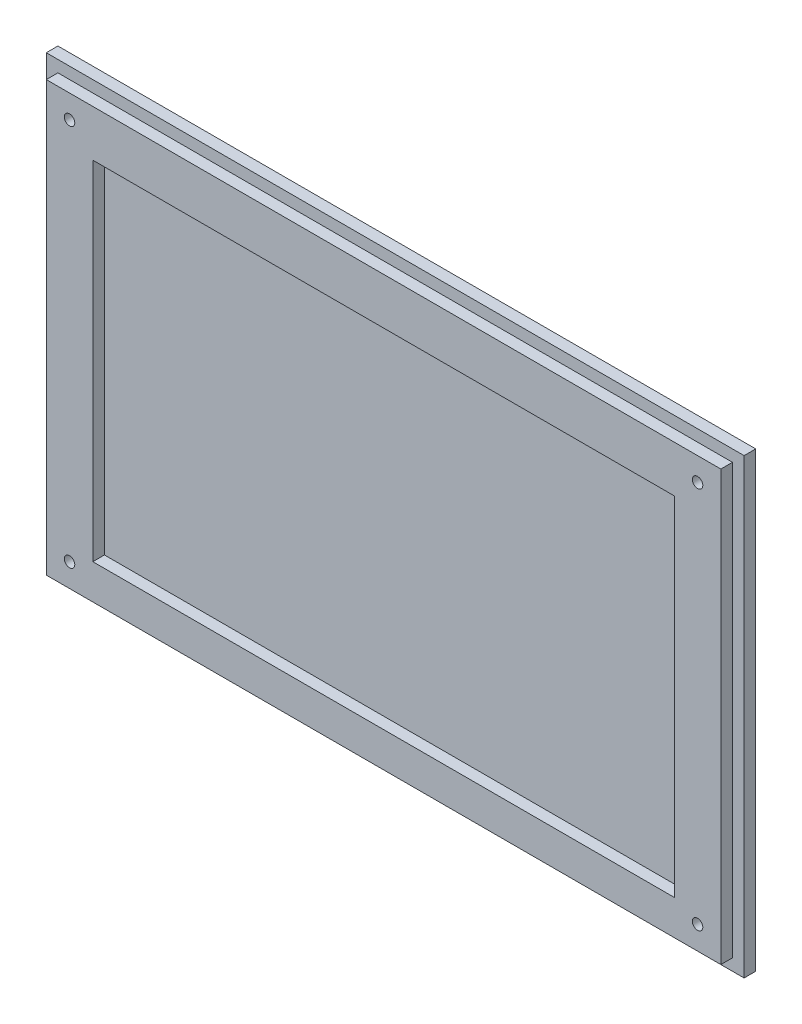
ISO-10303-21;
HEADER;
FILE_DESCRIPTION(('STEP AP214'),'2;1');
FILE_NAME('part.step','',(''),(''),'','','');
FILE_SCHEMA(('AUTOMOTIVE_DESIGN { 1 0 10303 214 1 1 1 1 }'));
ENDSEC;
DATA;
#1=APPLICATION_CONTEXT('core data for automotive mechanical design processes');
#2=APPLICATION_PROTOCOL_DEFINITION('international standard','automotive_design',2000,#1);
#3=PRODUCT_CONTEXT('',#1,'mechanical');
#4=PRODUCT('Part','Part','',(#3));
#5=PRODUCT_RELATED_PRODUCT_CATEGORY('part','',(#4));
#6=PRODUCT_DEFINITION_FORMATION('','',#4);
#7=PRODUCT_DEFINITION_CONTEXT('part definition',#1,'design');
#8=PRODUCT_DEFINITION('design','',#6,#7);
#9=PRODUCT_DEFINITION_SHAPE('','',#8);
#10=(LENGTH_UNIT() NAMED_UNIT(*) SI_UNIT(.MILLI.,.METRE.));
#11=(NAMED_UNIT(*) PLANE_ANGLE_UNIT() SI_UNIT($,.RADIAN.));
#12=(NAMED_UNIT(*) SI_UNIT($,.STERADIAN.) SOLID_ANGLE_UNIT());
#13=UNCERTAINTY_MEASURE_WITH_UNIT(LENGTH_MEASURE(1.E-05),#10,'distance_accuracy_value','');
#14=(GEOMETRIC_REPRESENTATION_CONTEXT(3) GLOBAL_UNCERTAINTY_ASSIGNED_CONTEXT((#13)) GLOBAL_UNIT_ASSIGNED_CONTEXT((#10,
#11,#12)) REPRESENTATION_CONTEXT('',''));
#15=CARTESIAN_POINT('',(0.,0.,0.));
#16=DIRECTION('',(0.,0.,1.));
#17=DIRECTION('',(1.,0.,0.));
#18=AXIS2_PLACEMENT_3D('',#15,#16,#17);
#19=CARTESIAN_POINT('',(0.,0.,10.));
#20=DIRECTION('',(0.,0.,1.));
#21=DIRECTION('',(1.,0.,0.));
#22=AXIS2_PLACEMENT_3D('',#19,#20,#21);
#23=PLANE('',#22);
#24=DIRECTION('',(1.,0.,0.));
#25=VECTOR('',#24,1.);
#26=CARTESIAN_POINT('',(144.733299505002,-75.4528301886792,10.));
#27=LINE('',#26,#25);
#28=CARTESIAN_POINT('',(-105.266700494998,-75.4528301886793,10.));
#29=VERTEX_POINT('',#28);
#30=CARTESIAN_POINT('',(144.733299505002,-75.4528301886792,10.));
#31=VERTEX_POINT('',#30);
#32=EDGE_CURVE('E133',#29,#31,#27,.T.);
#33=ORIENTED_EDGE('',*,*,#32,.F.);
#34=DIRECTION('',(0.,-1.,0.));
#35=VECTOR('',#34,1.);
#36=CARTESIAN_POINT('',(-105.266700494998,-75.4528301886793,10.));
#37=LINE('',#36,#35);
#38=CARTESIAN_POINT('',(-105.266700494998,74.0471698113207,10.));
#39=VERTEX_POINT('',#38);
#40=EDGE_CURVE('E123',#39,#29,#37,.T.);
#41=ORIENTED_EDGE('',*,*,#40,.F.);
#42=DIRECTION('',(-1.,0.,0.));
#43=VECTOR('',#42,1.);
#44=CARTESIAN_POINT('',(144.733299505002,74.0471698113208,10.));
#45=LINE('',#44,#43);
#46=CARTESIAN_POINT('',(144.733299505002,74.0471698113208,10.));
#47=VERTEX_POINT('',#46);
#48=EDGE_CURVE('E149',#47,#39,#45,.T.);
#49=ORIENTED_EDGE('',*,*,#48,.F.);
#50=DIRECTION('',(0.,1.,0.));
#51=VECTOR('',#50,1.);
#52=CARTESIAN_POINT('',(144.733299505002,-75.4528301886792,10.));
#53=LINE('',#52,#51);
#54=EDGE_CURVE('E147',#31,#47,#53,.T.);
#55=ORIENTED_EDGE('',*,*,#54,.F.);
#56=EDGE_LOOP('',(#33,#41,#49,#55));
#57=FACE_BOUND('',#56,.T.);
#58=DIRECTION('',(0.,-1.,0.));
#59=VECTOR('',#58,1.);
#60=CARTESIAN_POINT('',(-125.266700494998,94.0471698113208,10.));
#61=LINE('',#60,#59);
#62=CARTESIAN_POINT('',(-125.266700494998,94.0471698113208,10.));
#63=VERTEX_POINT('',#62);
#64=CARTESIAN_POINT('',(-125.266700494998,-90.4528301886792,10.));
#65=VERTEX_POINT('',#64);
#66=EDGE_CURVE('E167',#63,#65,#61,.T.);
#67=ORIENTED_EDGE('',*,*,#66,.T.);
#68=DIRECTION('',(1.,0.,0.));
#69=VECTOR('',#68,1.);
#70=CARTESIAN_POINT('',(-125.266700494998,-90.4528301886792,10.));
#71=LINE('',#70,#69);
#72=CARTESIAN_POINT('',(164.733299505002,-90.4528301886792,10.));
#73=VERTEX_POINT('',#72);
#74=EDGE_CURVE('E170',#65,#73,#71,.T.);
#75=ORIENTED_EDGE('',*,*,#74,.T.);
#76=DIRECTION('',(0.,1.,0.));
#77=VECTOR('',#76,1.);
#78=CARTESIAN_POINT('',(164.733299505002,94.0471698113208,10.));
#79=LINE('',#78,#77);
#80=CARTESIAN_POINT('',(164.733299505002,94.0471698113208,10.));
#81=VERTEX_POINT('',#80);
#82=EDGE_CURVE('E173',#73,#81,#79,.T.);
#83=ORIENTED_EDGE('',*,*,#82,.T.);
#84=DIRECTION('',(-1.,0.,0.));
#85=VECTOR('',#84,1.);
#86=CARTESIAN_POINT('',(-125.266700494998,94.0471698113208,10.));
#87=LINE('',#86,#85);
#88=EDGE_CURVE('E175',#81,#63,#87,.T.);
#89=ORIENTED_EDGE('',*,*,#88,.T.);
#90=EDGE_LOOP('',(#67,#75,#83,#89));
#91=FACE_BOUND('',#90,.T.);
#92=CARTESIAN_POINT('',(-115.266700494998,84.0471698113208,10.));
#93=DIRECTION('',(0.,0.,-1.));
#94=DIRECTION('',(-1.,0.,0.));
#95=AXIS2_PLACEMENT_3D('',#92,#93,#94);
#96=CIRCLE('',#95,2.25);
#97=CARTESIAN_POINT('',(-117.516700494998,84.0471698113208,10.));
#98=VERTEX_POINT('',#97);
#99=EDGE_CURVE('E156',#98,#98,#96,.T.);
#100=ORIENTED_EDGE('',*,*,#99,.T.);
#101=EDGE_LOOP('',(#100));
#102=FACE_BOUND('',#101,.T.);
#103=CARTESIAN_POINT('',(-115.266700494998,-80.4528301886792,10.));
#104=DIRECTION('',(0.,0.,-1.));
#105=DIRECTION('',(-1.,0.,0.));
#106=AXIS2_PLACEMENT_3D('',#103,#104,#105);
#107=CIRCLE('',#106,2.25);
#108=CARTESIAN_POINT('',(-117.516700494998,-80.4528301886792,10.));
#109=VERTEX_POINT('',#108);
#110=EDGE_CURVE('E536',#109,#109,#107,.T.);
#111=ORIENTED_EDGE('',*,*,#110,.T.);
#112=EDGE_LOOP('',(#111));
#113=FACE_BOUND('',#112,.T.);
#114=CARTESIAN_POINT('',(154.733299505002,-80.4528301886792,10.));
#115=DIRECTION('',(0.,0.,-1.));
#116=DIRECTION('',(-1.,0.,0.));
#117=AXIS2_PLACEMENT_3D('',#114,#115,#116);
#118=CIRCLE('',#117,2.25);
#119=CARTESIAN_POINT('',(152.483299505002,-80.4528301886792,10.));
#120=VERTEX_POINT('',#119);
#121=EDGE_CURVE('E524',#120,#120,#118,.T.);
#122=ORIENTED_EDGE('',*,*,#121,.T.);
#123=EDGE_LOOP('',(#122));
#124=FACE_BOUND('',#123,.T.);
#125=CARTESIAN_POINT('',(154.733299505002,84.0471698113208,10.));
#126=DIRECTION('',(0.,0.,-1.));
#127=DIRECTION('',(-1.,0.,0.));
#128=AXIS2_PLACEMENT_3D('',#125,#126,#127);
#129=CIRCLE('',#128,2.25);
#130=CARTESIAN_POINT('',(152.483299505002,84.0471698113208,10.));
#131=VERTEX_POINT('',#130);
#132=EDGE_CURVE('E512',#131,#131,#129,.T.);
#133=ORIENTED_EDGE('',*,*,#132,.T.);
#134=EDGE_LOOP('',(#133));
#135=FACE_BOUND('',#134,.T.);
#136=ADVANCED_FACE('F35',(#57,#91,#102,#113,#124,#135),#23,.T.);
#137=CARTESIAN_POINT('',(0.,0.,5.));
#138=DIRECTION('',(0.,0.,-1.));
#139=DIRECTION('',(-1.,0.,0.));
#140=AXIS2_PLACEMENT_3D('',#137,#138,#139);
#141=PLANE('',#140);
#142=DIRECTION('',(0.,1.,0.));
#143=VECTOR('',#142,1.);
#144=CARTESIAN_POINT('',(169.733299505002,-95.4528301886792,5.));
#145=LINE('',#144,#143);
#146=CARTESIAN_POINT('',(169.733299505002,-95.4528301886792,5.));
#147=VERTEX_POINT('',#146);
#148=CARTESIAN_POINT('',(169.733299505002,99.0471698113208,5.));
#149=VERTEX_POINT('',#148);
#150=EDGE_CURVE('E195',#147,#149,#145,.T.);
#151=ORIENTED_EDGE('',*,*,#150,.T.);
#152=DIRECTION('',(-1.,0.,0.));
#153=VECTOR('',#152,1.);
#154=CARTESIAN_POINT('',(-130.266700494998,99.0471698113208,5.));
#155=LINE('',#154,#153);
#156=CARTESIAN_POINT('',(-130.266700494998,99.0471698113208,5.));
#157=VERTEX_POINT('',#156);
#158=EDGE_CURVE('E198',#149,#157,#155,.T.);
#159=ORIENTED_EDGE('',*,*,#158,.T.);
#160=DIRECTION('',(0.,-1.,0.));
#161=VECTOR('',#160,1.);
#162=CARTESIAN_POINT('',(-130.266700494998,-95.4528301886792,5.));
#163=LINE('',#162,#161);
#164=CARTESIAN_POINT('',(-130.266700494998,-95.4528301886792,5.));
#165=VERTEX_POINT('',#164);
#166=EDGE_CURVE('E201',#157,#165,#163,.T.);
#167=ORIENTED_EDGE('',*,*,#166,.T.);
#168=DIRECTION('',(1.,0.,0.));
#169=VECTOR('',#168,1.);
#170=CARTESIAN_POINT('',(-130.266700494998,-95.4528301886792,5.));
#171=LINE('',#170,#169);
#172=EDGE_CURVE('E203',#165,#147,#171,.T.);
#173=ORIENTED_EDGE('',*,*,#172,.T.);
#174=EDGE_LOOP('',(#151,#159,#167,#173));
#175=FACE_BOUND('',#174,.T.);
#176=DIRECTION('',(0.,-1.,0.));
#177=VECTOR('',#176,1.);
#178=CARTESIAN_POINT('',(-125.266700494998,94.0471698113208,5.));
#179=LINE('',#178,#177);
#180=CARTESIAN_POINT('',(-125.266700494998,94.0471698113208,5.));
#181=VERTEX_POINT('',#180);
#182=CARTESIAN_POINT('',(-125.266700494998,-90.4528301886792,5.));
#183=VERTEX_POINT('',#182);
#184=EDGE_CURVE('E141',#181,#183,#179,.T.);
#185=ORIENTED_EDGE('',*,*,#184,.F.);
#186=DIRECTION('',(-1.,0.,0.));
#187=VECTOR('',#186,1.);
#188=CARTESIAN_POINT('',(-125.266700494998,94.0471698113208,5.));
#189=LINE('',#188,#187);
#190=CARTESIAN_POINT('',(164.733299505002,94.0471698113208,5.));
#191=VERTEX_POINT('',#190);
#192=EDGE_CURVE('E171',#191,#181,#189,.T.);
#193=ORIENTED_EDGE('',*,*,#192,.F.);
#194=DIRECTION('',(0.,1.,0.));
#195=VECTOR('',#194,1.);
#196=CARTESIAN_POINT('',(164.733299505002,94.0471698113208,5.));
#197=LINE('',#196,#195);
#198=CARTESIAN_POINT('',(164.733299505002,-90.4528301886792,5.));
#199=VERTEX_POINT('',#198);
#200=EDGE_CURVE('E55',#199,#191,#197,.T.);
#201=ORIENTED_EDGE('',*,*,#200,.F.);
#202=DIRECTION('',(1.,0.,0.));
#203=VECTOR('',#202,1.);
#204=CARTESIAN_POINT('',(-125.266700494998,-90.4528301886792,5.));
#205=LINE('',#204,#203);
#206=EDGE_CURVE('E50',#183,#199,#205,.T.);
#207=ORIENTED_EDGE('',*,*,#206,.F.);
#208=EDGE_LOOP('',(#185,#193,#201,#207));
#209=FACE_BOUND('',#208,.T.);
#210=ADVANCED_FACE('F237',(#175,#209),#141,.F.);
#211=CARTESIAN_POINT('',(169.733299505002,-95.4528301886792,5.));
#212=DIRECTION('',(-1.,0.,0.));
#213=DIRECTION('',(0.,0.,1.));
#214=AXIS2_PLACEMENT_3D('',#211,#212,#213);
#215=PLANE('',#214);
#216=DIRECTION('',(0.,1.,0.));
#217=VECTOR('',#216,1.);
#218=CARTESIAN_POINT('',(169.733299505002,-95.4528301886792,0.));
#219=LINE('',#218,#217);
#220=CARTESIAN_POINT('',(169.733299505002,-95.4528301886792,0.));
#221=VERTEX_POINT('',#220);
#222=CARTESIAN_POINT('',(169.733299505002,99.0471698113208,0.));
#223=VERTEX_POINT('',#222);
#224=EDGE_CURVE('E194',#221,#223,#219,.T.);
#225=ORIENTED_EDGE('',*,*,#224,.T.);
#226=DIRECTION('',(0.,0.,-1.));
#227=VECTOR('',#226,1.);
#228=CARTESIAN_POINT('',(169.733299505002,99.0471698113208,5.));
#229=LINE('',#228,#227);
#230=EDGE_CURVE('E11',#149,#223,#229,.T.);
#231=ORIENTED_EDGE('',*,*,#230,.F.);
#232=ORIENTED_EDGE('',*,*,#150,.F.);
#233=DIRECTION('',(0.,0.,-1.));
#234=VECTOR('',#233,1.);
#235=CARTESIAN_POINT('',(169.733299505002,-95.4528301886792,5.));
#236=LINE('',#235,#234);
#237=EDGE_CURVE('E205',#147,#221,#236,.T.);
#238=ORIENTED_EDGE('',*,*,#237,.T.);
#239=EDGE_LOOP('',(#225,#231,#232,#238));
#240=FACE_BOUND('',#239,.T.);
#241=ADVANCED_FACE('F37',(#240),#215,.F.);
#242=CARTESIAN_POINT('',(-130.266700494998,99.0471698113208,5.));
#243=DIRECTION('',(0.,-1.,0.));
#244=DIRECTION('',(0.,0.,-1.));
#245=AXIS2_PLACEMENT_3D('',#242,#243,#244);
#246=PLANE('',#245);
#247=DIRECTION('',(-1.,0.,0.));
#248=VECTOR('',#247,1.);
#249=CARTESIAN_POINT('',(-130.266700494998,99.0471698113208,0.));
#250=LINE('',#249,#248);
#251=CARTESIAN_POINT('',(-130.266700494998,99.0471698113208,0.));
#252=VERTEX_POINT('',#251);
#253=EDGE_CURVE('E208',#223,#252,#250,.T.);
#254=ORIENTED_EDGE('',*,*,#253,.T.);
#255=DIRECTION('',(0.,0.,-1.));
#256=VECTOR('',#255,1.);
#257=CARTESIAN_POINT('',(-130.266700494998,99.0471698113208,5.));
#258=LINE('',#257,#256);
#259=EDGE_CURVE('E43',#157,#252,#258,.T.);
#260=ORIENTED_EDGE('',*,*,#259,.F.);
#261=ORIENTED_EDGE('',*,*,#158,.F.);
#262=ORIENTED_EDGE('',*,*,#230,.T.);
#263=EDGE_LOOP('',(#254,#260,#261,#262));
#264=FACE_BOUND('',#263,.T.);
#265=ADVANCED_FACE('F238',(#264),#246,.F.);
#266=CARTESIAN_POINT('',(-130.266700494998,-95.4528301886792,5.));
#267=DIRECTION('',(1.,0.,0.));
#268=DIRECTION('',(0.,0.,-1.));
#269=AXIS2_PLACEMENT_3D('',#266,#267,#268);
#270=PLANE('',#269);
#271=DIRECTION('',(0.,-1.,0.));
#272=VECTOR('',#271,1.);
#273=CARTESIAN_POINT('',(-130.266700494998,-95.4528301886792,0.));
#274=LINE('',#273,#272);
#275=CARTESIAN_POINT('',(-130.266700494998,-95.4528301886792,0.));
#276=VERTEX_POINT('',#275);
#277=EDGE_CURVE('E210',#252,#276,#274,.T.);
#278=ORIENTED_EDGE('',*,*,#277,.T.);
#279=DIRECTION('',(0.,0.,-1.));
#280=VECTOR('',#279,1.);
#281=CARTESIAN_POINT('',(-130.266700494998,-95.4528301886792,5.));
#282=LINE('',#281,#280);
#283=EDGE_CURVE('E215',#165,#276,#282,.T.);
#284=ORIENTED_EDGE('',*,*,#283,.F.);
#285=ORIENTED_EDGE('',*,*,#166,.F.);
#286=ORIENTED_EDGE('',*,*,#259,.T.);
#287=EDGE_LOOP('',(#278,#284,#285,#286));
#288=FACE_BOUND('',#287,.T.);
#289=ADVANCED_FACE('F222',(#288),#270,.F.);
#290=CARTESIAN_POINT('',(-130.266700494998,-95.4528301886792,5.));
#291=DIRECTION('',(0.,1.,0.));
#292=DIRECTION('',(0.,0.,1.));
#293=AXIS2_PLACEMENT_3D('',#290,#291,#292);
#294=PLANE('',#293);
#295=DIRECTION('',(1.,0.,0.));
#296=VECTOR('',#295,1.);
#297=CARTESIAN_POINT('',(-130.266700494998,-95.4528301886792,0.));
#298=LINE('',#297,#296);
#299=EDGE_CURVE('E199',#276,#221,#298,.T.);
#300=ORIENTED_EDGE('',*,*,#299,.T.);
#301=ORIENTED_EDGE('',*,*,#237,.F.);
#302=ORIENTED_EDGE('',*,*,#172,.F.);
#303=ORIENTED_EDGE('',*,*,#283,.T.);
#304=EDGE_LOOP('',(#300,#301,#302,#303));
#305=FACE_BOUND('',#304,.T.);
#306=ADVANCED_FACE('F231',(#305),#294,.F.);
#307=CARTESIAN_POINT('',(0.,0.,0.));
#308=DIRECTION('',(0.,0.,-1.));
#309=DIRECTION('',(-1.,0.,0.));
#310=AXIS2_PLACEMENT_3D('',#307,#308,#309);
#311=PLANE('',#310);
#312=CARTESIAN_POINT('',(154.733299505002,84.0471698113208,0.));
#313=DIRECTION('',(0.,0.,-1.));
#314=DIRECTION('',(-1.,0.,0.));
#315=AXIS2_PLACEMENT_3D('',#312,#313,#314);
#316=CIRCLE('',#315,4.3);
#317=CARTESIAN_POINT('',(150.433299505002,84.0471698113208,0.));
#318=VERTEX_POINT('',#317);
#319=EDGE_CURVE('E505',#318,#318,#316,.T.);
#320=ORIENTED_EDGE('',*,*,#319,.F.);
#321=EDGE_LOOP('',(#320));
#322=FACE_BOUND('',#321,.T.);
#323=CARTESIAN_POINT('',(154.733299505002,-80.4528301886792,0.));
#324=DIRECTION('',(0.,0.,-1.));
#325=DIRECTION('',(-1.,0.,0.));
#326=AXIS2_PLACEMENT_3D('',#323,#324,#325);
#327=CIRCLE('',#326,4.3);
#328=CARTESIAN_POINT('',(150.433299505002,-80.4528301886792,0.));
#329=VERTEX_POINT('',#328);
#330=EDGE_CURVE('E515',#329,#329,#327,.T.);
#331=ORIENTED_EDGE('',*,*,#330,.F.);
#332=EDGE_LOOP('',(#331));
#333=FACE_BOUND('',#332,.T.);
#334=CARTESIAN_POINT('',(-115.266700494998,-80.4528301886792,0.));
#335=DIRECTION('',(0.,0.,-1.));
#336=DIRECTION('',(-1.,0.,0.));
#337=AXIS2_PLACEMENT_3D('',#334,#335,#336);
#338=CIRCLE('',#337,4.3);
#339=CARTESIAN_POINT('',(-119.566700494998,-80.4528301886792,0.));
#340=VERTEX_POINT('',#339);
#341=EDGE_CURVE('E527',#340,#340,#338,.T.);
#342=ORIENTED_EDGE('',*,*,#341,.F.);
#343=EDGE_LOOP('',(#342));
#344=FACE_BOUND('',#343,.T.);
#345=CARTESIAN_POINT('',(-115.266700494998,84.0471698113208,0.));
#346=DIRECTION('',(0.,0.,-1.));
#347=DIRECTION('',(-1.,0.,0.));
#348=AXIS2_PLACEMENT_3D('',#345,#346,#347);
#349=CIRCLE('',#348,4.3);
#350=CARTESIAN_POINT('',(-119.566700494998,84.0471698113208,0.));
#351=VERTEX_POINT('',#350);
#352=EDGE_CURVE('E539',#351,#351,#349,.T.);
#353=ORIENTED_EDGE('',*,*,#352,.F.);
#354=EDGE_LOOP('',(#353));
#355=FACE_BOUND('',#354,.T.);
#356=ORIENTED_EDGE('',*,*,#224,.F.);
#357=ORIENTED_EDGE('',*,*,#299,.F.);
#358=ORIENTED_EDGE('',*,*,#277,.F.);
#359=ORIENTED_EDGE('',*,*,#253,.F.);
#360=EDGE_LOOP('',(#356,#357,#358,#359));
#361=FACE_BOUND('',#360,.T.);
#362=ADVANCED_FACE('F228',(#322,#333,#344,#355,#361),#311,.T.);
#363=CARTESIAN_POINT('',(-125.266700494998,94.0471698113208,10.));
#364=DIRECTION('',(1.,0.,0.));
#365=DIRECTION('',(0.,0.,-1.));
#366=AXIS2_PLACEMENT_3D('',#363,#364,#365);
#367=PLANE('',#366);
#368=ORIENTED_EDGE('',*,*,#184,.T.);
#369=DIRECTION('',(0.,0.,-1.));
#370=VECTOR('',#369,1.);
#371=CARTESIAN_POINT('',(-125.266700494998,-90.4528301886792,10.));
#372=LINE('',#371,#370);
#373=EDGE_CURVE('E192',#65,#183,#372,.T.);
#374=ORIENTED_EDGE('',*,*,#373,.F.);
#375=ORIENTED_EDGE('',*,*,#66,.F.);
#376=DIRECTION('',(0.,0.,-1.));
#377=VECTOR('',#376,1.);
#378=CARTESIAN_POINT('',(-125.266700494998,94.0471698113208,10.));
#379=LINE('',#378,#377);
#380=EDGE_CURVE('E177',#63,#181,#379,.T.);
#381=ORIENTED_EDGE('',*,*,#380,.T.);
#382=EDGE_LOOP('',(#368,#374,#375,#381));
#383=FACE_BOUND('',#382,.T.);
#384=ADVANCED_FACE('F266',(#383),#367,.F.);
#385=CARTESIAN_POINT('',(-125.266700494998,-90.4528301886792,10.));
#386=DIRECTION('',(0.,1.,0.));
#387=DIRECTION('',(0.,0.,1.));
#388=AXIS2_PLACEMENT_3D('',#385,#386,#387);
#389=PLANE('',#388);
#390=ORIENTED_EDGE('',*,*,#206,.T.);
#391=DIRECTION('',(0.,0.,-1.));
#392=VECTOR('',#391,1.);
#393=CARTESIAN_POINT('',(164.733299505002,-90.4528301886792,10.));
#394=LINE('',#393,#392);
#395=EDGE_CURVE('E189',#73,#199,#394,.T.);
#396=ORIENTED_EDGE('',*,*,#395,.F.);
#397=ORIENTED_EDGE('',*,*,#74,.F.);
#398=ORIENTED_EDGE('',*,*,#373,.T.);
#399=EDGE_LOOP('',(#390,#396,#397,#398));
#400=FACE_BOUND('',#399,.T.);
#401=ADVANCED_FACE('F262',(#400),#389,.F.);
#402=CARTESIAN_POINT('',(164.733299505002,94.0471698113208,10.));
#403=DIRECTION('',(-1.,0.,0.));
#404=DIRECTION('',(0.,-1.,0.));
#405=AXIS2_PLACEMENT_3D('',#402,#403,#404);
#406=PLANE('',#405);
#407=ORIENTED_EDGE('',*,*,#200,.T.);
#408=DIRECTION('',(0.,0.,-1.));
#409=VECTOR('',#408,1.);
#410=CARTESIAN_POINT('',(164.733299505002,94.0471698113208,10.));
#411=LINE('',#410,#409);
#412=EDGE_CURVE('E186',#81,#191,#411,.T.);
#413=ORIENTED_EDGE('',*,*,#412,.F.);
#414=ORIENTED_EDGE('',*,*,#82,.F.);
#415=ORIENTED_EDGE('',*,*,#395,.T.);
#416=EDGE_LOOP('',(#407,#413,#414,#415));
#417=FACE_BOUND('',#416,.T.);
#418=ADVANCED_FACE('F258',(#417),#406,.F.);
#419=CARTESIAN_POINT('',(-125.266700494998,94.0471698113208,10.));
#420=DIRECTION('',(0.,-1.,0.));
#421=DIRECTION('',(0.,0.,-1.));
#422=AXIS2_PLACEMENT_3D('',#419,#420,#421);
#423=PLANE('',#422);
#424=ORIENTED_EDGE('',*,*,#192,.T.);
#425=ORIENTED_EDGE('',*,*,#380,.F.);
#426=ORIENTED_EDGE('',*,*,#88,.F.);
#427=ORIENTED_EDGE('',*,*,#412,.T.);
#428=EDGE_LOOP('',(#424,#425,#426,#427));
#429=FACE_BOUND('',#428,.T.);
#430=ADVANCED_FACE('F255',(#429),#423,.F.);
#431=CARTESIAN_POINT('',(-105.266700494998,-75.4528301886793,10.));
#432=DIRECTION('',(1.,0.,0.));
#433=DIRECTION('',(0.,1.,0.));
#434=AXIS2_PLACEMENT_3D('',#431,#432,#433);
#435=PLANE('',#434);
#436=DIRECTION('',(0.,-1.,0.));
#437=VECTOR('',#436,1.);
#438=CARTESIAN_POINT('',(-105.266700494998,-75.4528301886793,5.));
#439=LINE('',#438,#437);
#440=CARTESIAN_POINT('',(-105.266700494998,74.0471698113207,5.));
#441=VERTEX_POINT('',#440);
#442=CARTESIAN_POINT('',(-105.266700494998,-75.4528301886793,5.));
#443=VERTEX_POINT('',#442);
#444=EDGE_CURVE('E154',#441,#443,#439,.T.);
#445=ORIENTED_EDGE('',*,*,#444,.F.);
#446=DIRECTION('',(0.,0.,-1.));
#447=VECTOR('',#446,1.);
#448=CARTESIAN_POINT('',(-105.266700494998,74.0471698113207,10.));
#449=LINE('',#448,#447);
#450=EDGE_CURVE('E129',#39,#441,#449,.T.);
#451=ORIENTED_EDGE('',*,*,#450,.F.);
#452=ORIENTED_EDGE('',*,*,#40,.T.);
#453=DIRECTION('',(0.,0.,-1.));
#454=VECTOR('',#453,1.);
#455=CARTESIAN_POINT('',(-105.266700494998,-75.4528301886793,10.));
#456=LINE('',#455,#454);
#457=EDGE_CURVE('E127',#29,#443,#456,.T.);
#458=ORIENTED_EDGE('',*,*,#457,.T.);
#459=EDGE_LOOP('',(#445,#451,#452,#458));
#460=FACE_BOUND('',#459,.T.);
#461=ADVANCED_FACE('F126',(#460),#435,.T.);
#462=CARTESIAN_POINT('',(144.733299505002,-75.4528301886792,10.));
#463=DIRECTION('',(0.,1.,0.));
#464=DIRECTION('',(-1.,0.,0.));
#465=AXIS2_PLACEMENT_3D('',#462,#463,#464);
#466=PLANE('',#465);
#467=DIRECTION('',(1.,0.,0.));
#468=VECTOR('',#467,1.);
#469=CARTESIAN_POINT('',(144.733299505002,-75.4528301886792,5.));
#470=LINE('',#469,#468);
#471=CARTESIAN_POINT('',(144.733299505002,-75.4528301886792,5.));
#472=VERTEX_POINT('',#471);
#473=EDGE_CURVE('E140',#443,#472,#470,.T.);
#474=ORIENTED_EDGE('',*,*,#473,.F.);
#475=ORIENTED_EDGE('',*,*,#457,.F.);
#476=ORIENTED_EDGE('',*,*,#32,.T.);
#477=DIRECTION('',(0.,0.,-1.));
#478=VECTOR('',#477,1.);
#479=CARTESIAN_POINT('',(144.733299505002,-75.4528301886792,10.));
#480=LINE('',#479,#478);
#481=EDGE_CURVE('E142',#31,#472,#480,.T.);
#482=ORIENTED_EDGE('',*,*,#481,.T.);
#483=EDGE_LOOP('',(#474,#475,#476,#482));
#484=FACE_BOUND('',#483,.T.);
#485=ADVANCED_FACE('F137',(#484),#466,.T.);
#486=CARTESIAN_POINT('',(144.733299505002,-75.4528301886792,10.));
#487=DIRECTION('',(-1.,0.,0.));
#488=DIRECTION('',(0.,0.,1.));
#489=AXIS2_PLACEMENT_3D('',#486,#487,#488);
#490=PLANE('',#489);
#491=DIRECTION('',(0.,1.,0.));
#492=VECTOR('',#491,1.);
#493=CARTESIAN_POINT('',(144.733299505002,-75.4528301886792,5.));
#494=LINE('',#493,#492);
#495=CARTESIAN_POINT('',(144.733299505002,74.0471698113208,5.));
#496=VERTEX_POINT('',#495);
#497=EDGE_CURVE('E158',#472,#496,#494,.T.);
#498=ORIENTED_EDGE('',*,*,#497,.F.);
#499=ORIENTED_EDGE('',*,*,#481,.F.);
#500=ORIENTED_EDGE('',*,*,#54,.T.);
#501=DIRECTION('',(0.,0.,-1.));
#502=VECTOR('',#501,1.);
#503=CARTESIAN_POINT('',(144.733299505002,74.0471698113208,10.));
#504=LINE('',#503,#502);
#505=EDGE_CURVE('E164',#47,#496,#504,.T.);
#506=ORIENTED_EDGE('',*,*,#505,.T.);
#507=EDGE_LOOP('',(#498,#499,#500,#506));
#508=FACE_BOUND('',#507,.T.);
#509=ADVANCED_FACE('F316',(#508),#490,.T.);
#510=CARTESIAN_POINT('',(144.733299505002,74.0471698113208,10.));
#511=DIRECTION('',(0.,-1.,0.));
#512=DIRECTION('',(1.,0.,0.));
#513=AXIS2_PLACEMENT_3D('',#510,#511,#512);
#514=PLANE('',#513);
#515=DIRECTION('',(-1.,0.,0.));
#516=VECTOR('',#515,1.);
#517=CARTESIAN_POINT('',(144.733299505002,74.0471698113208,5.));
#518=LINE('',#517,#516);
#519=EDGE_CURVE('E134',#496,#441,#518,.T.);
#520=ORIENTED_EDGE('',*,*,#519,.F.);
#521=ORIENTED_EDGE('',*,*,#505,.F.);
#522=ORIENTED_EDGE('',*,*,#48,.T.);
#523=ORIENTED_EDGE('',*,*,#450,.T.);
#524=EDGE_LOOP('',(#520,#521,#522,#523));
#525=FACE_BOUND('',#524,.T.);
#526=ADVANCED_FACE('F273',(#525),#514,.T.);
#527=ORIENTED_EDGE('',*,*,#519,.T.);
#528=ORIENTED_EDGE('',*,*,#444,.T.);
#529=ORIENTED_EDGE('',*,*,#473,.T.);
#530=ORIENTED_EDGE('',*,*,#497,.T.);
#531=EDGE_LOOP('',(#527,#528,#529,#530));
#532=FACE_BOUND('',#531,.T.);
#533=ADVANCED_FACE('F251',(#532),#141,.F.);
#534=CARTESIAN_POINT('',(-115.266700494998,84.0471698113208,0.));
#535=DIRECTION('',(0.,0.,-1.));
#536=DIRECTION('',(-1.,0.,0.));
#537=AXIS2_PLACEMENT_3D('',#534,#535,#536);
#538=CYLINDRICAL_SURFACE('',#537,2.25);
#539=ORIENTED_EDGE('',*,*,#99,.F.);
#540=EDGE_LOOP('',(#539));
#541=FACE_BOUND('',#540,.T.);
#542=CARTESIAN_POINT('',(-115.266700494998,84.0471698113208,2.2));
#543=DIRECTION('',(0.,0.,-1.));
#544=DIRECTION('',(-1.,0.,0.));
#545=AXIS2_PLACEMENT_3D('',#542,#543,#544);
#546=CIRCLE('',#545,2.25);
#547=CARTESIAN_POINT('',(-117.516700494998,84.0471698113208,2.2));
#548=VERTEX_POINT('',#547);
#549=EDGE_CURVE('E545',#548,#548,#546,.T.);
#550=ORIENTED_EDGE('',*,*,#549,.T.);
#551=EDGE_LOOP('',(#550));
#552=FACE_BOUND('',#551,.T.);
#553=ADVANCED_FACE('F272',(#541,#552),#538,.F.);
#554=CARTESIAN_POINT('',(-113.016700494998,84.0471698113208,2.2));
#555=DIRECTION('',(0.,0.,1.));
#556=DIRECTION('',(1.,0.,0.));
#557=AXIS2_PLACEMENT_3D('',#554,#555,#556);
#558=PLANE('',#557);
#559=ORIENTED_EDGE('',*,*,#549,.F.);
#560=EDGE_LOOP('',(#559));
#561=FACE_BOUND('',#560,.T.);
#562=CARTESIAN_POINT('',(-115.266700494998,84.0471698113208,2.2));
#563=DIRECTION('',(0.,0.,-1.));
#564=DIRECTION('',(-1.,0.,0.));
#565=AXIS2_PLACEMENT_3D('',#562,#563,#564);
#566=CIRCLE('',#565,4.3);
#567=CARTESIAN_POINT('',(-119.566700494998,84.0471698113208,2.2));
#568=VERTEX_POINT('',#567);
#569=EDGE_CURVE('E542',#568,#568,#566,.T.);
#570=ORIENTED_EDGE('',*,*,#569,.T.);
#571=EDGE_LOOP('',(#570));
#572=FACE_BOUND('',#571,.T.);
#573=ADVANCED_FACE('F340',(#561,#572),#558,.F.);
#574=CARTESIAN_POINT('',(-115.266700494998,84.0471698113208,0.));
#575=DIRECTION('',(0.,0.,-1.));
#576=DIRECTION('',(-1.,0.,0.));
#577=AXIS2_PLACEMENT_3D('',#574,#575,#576);
#578=CYLINDRICAL_SURFACE('',#577,4.3);
#579=ORIENTED_EDGE('',*,*,#569,.F.);
#580=EDGE_LOOP('',(#579));
#581=FACE_BOUND('',#580,.T.);
#582=ORIENTED_EDGE('',*,*,#352,.T.);
#583=EDGE_LOOP('',(#582));
#584=FACE_BOUND('',#583,.T.);
#585=ADVANCED_FACE('F348',(#581,#584),#578,.F.);
#586=CARTESIAN_POINT('',(-115.266700494998,-80.4528301886792,0.));
#587=DIRECTION('',(0.,0.,-1.));
#588=DIRECTION('',(-1.,0.,0.));
#589=AXIS2_PLACEMENT_3D('',#586,#587,#588);
#590=CYLINDRICAL_SURFACE('',#589,2.25);
#591=ORIENTED_EDGE('',*,*,#110,.F.);
#592=EDGE_LOOP('',(#591));
#593=FACE_BOUND('',#592,.T.);
#594=CARTESIAN_POINT('',(-115.266700494998,-80.4528301886792,2.2));
#595=DIRECTION('',(0.,0.,-1.));
#596=DIRECTION('',(-1.,0.,0.));
#597=AXIS2_PLACEMENT_3D('',#594,#595,#596);
#598=CIRCLE('',#597,2.25);
#599=CARTESIAN_POINT('',(-117.516700494998,-80.4528301886792,2.2));
#600=VERTEX_POINT('',#599);
#601=EDGE_CURVE('E533',#600,#600,#598,.T.);
#602=ORIENTED_EDGE('',*,*,#601,.T.);
#603=EDGE_LOOP('',(#602));
#604=FACE_BOUND('',#603,.T.);
#605=ADVANCED_FACE('F356',(#593,#604),#590,.F.);
#606=CARTESIAN_POINT('',(-113.016700494998,-80.4528301886792,2.2));
#607=DIRECTION('',(0.,0.,1.));
#608=DIRECTION('',(1.,0.,0.));
#609=AXIS2_PLACEMENT_3D('',#606,#607,#608);
#610=PLANE('',#609);
#611=ORIENTED_EDGE('',*,*,#601,.F.);
#612=EDGE_LOOP('',(#611));
#613=FACE_BOUND('',#612,.T.);
#614=CARTESIAN_POINT('',(-115.266700494998,-80.4528301886792,2.2));
#615=DIRECTION('',(0.,0.,-1.));
#616=DIRECTION('',(-1.,0.,0.));
#617=AXIS2_PLACEMENT_3D('',#614,#615,#616);
#618=CIRCLE('',#617,4.3);
#619=CARTESIAN_POINT('',(-119.566700494998,-80.4528301886792,2.2));
#620=VERTEX_POINT('',#619);
#621=EDGE_CURVE('E530',#620,#620,#618,.T.);
#622=ORIENTED_EDGE('',*,*,#621,.T.);
#623=EDGE_LOOP('',(#622));
#624=FACE_BOUND('',#623,.T.);
#625=ADVANCED_FACE('F364',(#613,#624),#610,.F.);
#626=CARTESIAN_POINT('',(-115.266700494998,-80.4528301886792,0.));
#627=DIRECTION('',(0.,0.,-1.));
#628=DIRECTION('',(-1.,0.,0.));
#629=AXIS2_PLACEMENT_3D('',#626,#627,#628);
#630=CYLINDRICAL_SURFACE('',#629,4.3);
#631=ORIENTED_EDGE('',*,*,#621,.F.);
#632=EDGE_LOOP('',(#631));
#633=FACE_BOUND('',#632,.T.);
#634=ORIENTED_EDGE('',*,*,#341,.T.);
#635=EDGE_LOOP('',(#634));
#636=FACE_BOUND('',#635,.T.);
#637=ADVANCED_FACE('F372',(#633,#636),#630,.F.);
#638=CARTESIAN_POINT('',(154.733299505002,-80.4528301886792,0.));
#639=DIRECTION('',(0.,0.,-1.));
#640=DIRECTION('',(-1.,0.,0.));
#641=AXIS2_PLACEMENT_3D('',#638,#639,#640);
#642=CYLINDRICAL_SURFACE('',#641,2.25);
#643=ORIENTED_EDGE('',*,*,#121,.F.);
#644=EDGE_LOOP('',(#643));
#645=FACE_BOUND('',#644,.T.);
#646=CARTESIAN_POINT('',(154.733299505002,-80.4528301886792,2.2));
#647=DIRECTION('',(0.,0.,-1.));
#648=DIRECTION('',(-1.,0.,0.));
#649=AXIS2_PLACEMENT_3D('',#646,#647,#648);
#650=CIRCLE('',#649,2.25);
#651=CARTESIAN_POINT('',(152.483299505002,-80.4528301886792,2.2));
#652=VERTEX_POINT('',#651);
#653=EDGE_CURVE('E521',#652,#652,#650,.T.);
#654=ORIENTED_EDGE('',*,*,#653,.T.);
#655=EDGE_LOOP('',(#654));
#656=FACE_BOUND('',#655,.T.);
#657=ADVANCED_FACE('F380',(#645,#656),#642,.F.);
#658=CARTESIAN_POINT('',(156.983299505002,-80.4528301886792,2.2));
#659=DIRECTION('',(0.,0.,1.));
#660=DIRECTION('',(1.,0.,0.));
#661=AXIS2_PLACEMENT_3D('',#658,#659,#660);
#662=PLANE('',#661);
#663=ORIENTED_EDGE('',*,*,#653,.F.);
#664=EDGE_LOOP('',(#663));
#665=FACE_BOUND('',#664,.T.);
#666=CARTESIAN_POINT('',(154.733299505002,-80.4528301886792,2.2));
#667=DIRECTION('',(0.,0.,-1.));
#668=DIRECTION('',(-1.,0.,0.));
#669=AXIS2_PLACEMENT_3D('',#666,#667,#668);
#670=CIRCLE('',#669,4.3);
#671=CARTESIAN_POINT('',(150.433299505002,-80.4528301886792,2.2));
#672=VERTEX_POINT('',#671);
#673=EDGE_CURVE('E518',#672,#672,#670,.T.);
#674=ORIENTED_EDGE('',*,*,#673,.T.);
#675=EDGE_LOOP('',(#674));
#676=FACE_BOUND('',#675,.T.);
#677=ADVANCED_FACE('F387',(#665,#676),#662,.F.);
#678=CARTESIAN_POINT('',(154.733299505002,-80.4528301886792,0.));
#679=DIRECTION('',(0.,0.,-1.));
#680=DIRECTION('',(-1.,0.,0.));
#681=AXIS2_PLACEMENT_3D('',#678,#679,#680);
#682=CYLINDRICAL_SURFACE('',#681,4.3);
#683=ORIENTED_EDGE('',*,*,#673,.F.);
#684=EDGE_LOOP('',(#683));
#685=FACE_BOUND('',#684,.T.);
#686=ORIENTED_EDGE('',*,*,#330,.T.);
#687=EDGE_LOOP('',(#686));
#688=FACE_BOUND('',#687,.T.);
#689=ADVANCED_FACE('F395',(#685,#688),#682,.F.);
#690=CARTESIAN_POINT('',(154.733299505002,84.0471698113208,0.));
#691=DIRECTION('',(0.,0.,-1.));
#692=DIRECTION('',(-1.,0.,0.));
#693=AXIS2_PLACEMENT_3D('',#690,#691,#692);
#694=CYLINDRICAL_SURFACE('',#693,2.25);
#695=ORIENTED_EDGE('',*,*,#132,.F.);
#696=EDGE_LOOP('',(#695));
#697=FACE_BOUND('',#696,.T.);
#698=CARTESIAN_POINT('',(154.733299505002,84.0471698113208,2.2));
#699=DIRECTION('',(0.,0.,-1.));
#700=DIRECTION('',(-1.,0.,0.));
#701=AXIS2_PLACEMENT_3D('',#698,#699,#700);
#702=CIRCLE('',#701,2.25);
#703=CARTESIAN_POINT('',(152.483299505002,84.0471698113208,2.2));
#704=VERTEX_POINT('',#703);
#705=EDGE_CURVE('E507',#704,#704,#702,.T.);
#706=ORIENTED_EDGE('',*,*,#705,.T.);
#707=EDGE_LOOP('',(#706));
#708=FACE_BOUND('',#707,.T.);
#709=ADVANCED_FACE('F403',(#697,#708),#694,.F.);
#710=CARTESIAN_POINT('',(156.983299505002,84.0471698113208,2.2));
#711=DIRECTION('',(0.,0.,1.));
#712=DIRECTION('',(1.,0.,0.));
#713=AXIS2_PLACEMENT_3D('',#710,#711,#712);
#714=PLANE('',#713);
#715=ORIENTED_EDGE('',*,*,#705,.F.);
#716=EDGE_LOOP('',(#715));
#717=FACE_BOUND('',#716,.T.);
#718=CARTESIAN_POINT('',(154.733299505002,84.0471698113208,2.2));
#719=DIRECTION('',(0.,0.,-1.));
#720=DIRECTION('',(-1.,0.,0.));
#721=AXIS2_PLACEMENT_3D('',#718,#719,#720);
#722=CIRCLE('',#721,4.3);
#723=CARTESIAN_POINT('',(150.433299505002,84.0471698113208,2.2));
#724=VERTEX_POINT('',#723);
#725=EDGE_CURVE('E502',#724,#724,#722,.T.);
#726=ORIENTED_EDGE('',*,*,#725,.T.);
#727=EDGE_LOOP('',(#726));
#728=FACE_BOUND('',#727,.T.);
#729=ADVANCED_FACE('F411',(#717,#728),#714,.F.);
#730=CARTESIAN_POINT('',(154.733299505002,84.0471698113208,0.));
#731=DIRECTION('',(0.,0.,-1.));
#732=DIRECTION('',(-1.,0.,0.));
#733=AXIS2_PLACEMENT_3D('',#730,#731,#732);
#734=CYLINDRICAL_SURFACE('',#733,4.3);
#735=ORIENTED_EDGE('',*,*,#725,.F.);
#736=EDGE_LOOP('',(#735));
#737=FACE_BOUND('',#736,.T.);
#738=ORIENTED_EDGE('',*,*,#319,.T.);
#739=EDGE_LOOP('',(#738));
#740=FACE_BOUND('',#739,.T.);
#741=ADVANCED_FACE('F419',(#737,#740),#734,.F.);
#742=CLOSED_SHELL('',(#136,#210,#241,#265,#289,#306,#362,#384,#401,#418,#430,#461,#485,#509,
#526,#533,#553,#573,#585,#605,#625,#637,#657,#677,#689,#709,#729,#741));
#743=MANIFOLD_SOLID_BREP('B2',#742);
#744=ADVANCED_BREP_SHAPE_REPRESENTATION('',(#18,#743),#14);
#745=SHAPE_DEFINITION_REPRESENTATION(#9,#744);
ENDSEC;
END-ISO-10303-21;
